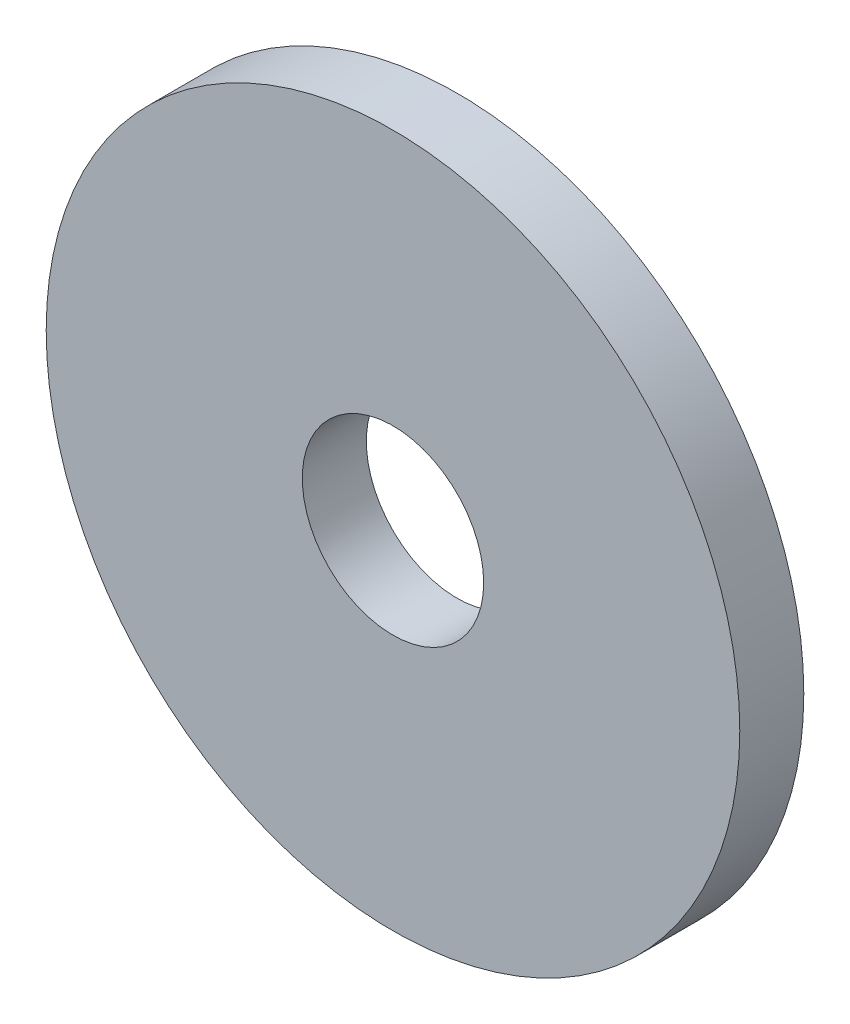
ISO-10303-21;
HEADER;
FILE_DESCRIPTION(('STEP AP214'),'2;1');
FILE_NAME('part.step','',(''),(''),'','','');
FILE_SCHEMA(('AUTOMOTIVE_DESIGN { 1 0 10303 214 1 1 1 1 }'));
ENDSEC;
DATA;
#1=APPLICATION_CONTEXT('core data for automotive mechanical design processes');
#2=APPLICATION_PROTOCOL_DEFINITION('international standard','automotive_design',2000,#1);
#3=PRODUCT_CONTEXT('',#1,'mechanical');
#4=PRODUCT('Part','Part','',(#3));
#5=PRODUCT_RELATED_PRODUCT_CATEGORY('part','',(#4));
#6=PRODUCT_DEFINITION_FORMATION('','',#4);
#7=PRODUCT_DEFINITION_CONTEXT('part definition',#1,'design');
#8=PRODUCT_DEFINITION('design','',#6,#7);
#9=PRODUCT_DEFINITION_SHAPE('','',#8);
#10=(LENGTH_UNIT() NAMED_UNIT(*) SI_UNIT(.MILLI.,.METRE.));
#11=(NAMED_UNIT(*) PLANE_ANGLE_UNIT() SI_UNIT($,.RADIAN.));
#12=(NAMED_UNIT(*) SI_UNIT($,.STERADIAN.) SOLID_ANGLE_UNIT());
#13=UNCERTAINTY_MEASURE_WITH_UNIT(LENGTH_MEASURE(1.E-05),#10,'distance_accuracy_value','');
#14=(GEOMETRIC_REPRESENTATION_CONTEXT(3) GLOBAL_UNCERTAINTY_ASSIGNED_CONTEXT((#13)) GLOBAL_UNIT_ASSIGNED_CONTEXT((#10,
#11,#12)) REPRESENTATION_CONTEXT('',''));
#15=CARTESIAN_POINT('',(0.,0.,0.));
#16=DIRECTION('',(0.,0.,1.));
#17=DIRECTION('',(1.,0.,0.));
#18=AXIS2_PLACEMENT_3D('',#15,#16,#17);
#19=CARTESIAN_POINT('',(0.,0.,6.));
#20=DIRECTION('',(0.,0.,1.));
#21=DIRECTION('',(1.,0.,0.));
#22=AXIS2_PLACEMENT_3D('',#19,#20,#21);
#23=PLANE('',#22);
#24=CARTESIAN_POINT('',(0.,0.,6.));
#25=DIRECTION('',(0.,0.,1.));
#26=DIRECTION('',(1.,0.,0.));
#27=AXIS2_PLACEMENT_3D('',#24,#25,#26);
#28=CIRCLE('',#27,32.5);
#29=CARTESIAN_POINT('',(32.5,0.,6.));
#30=VERTEX_POINT('',#29);
#31=EDGE_CURVE('E10',#30,#30,#28,.T.);
#32=ORIENTED_EDGE('',*,*,#31,.T.);
#33=EDGE_LOOP('',(#32));
#34=FACE_BOUND('',#33,.T.);
#35=CARTESIAN_POINT('',(0.,0.,6.));
#36=DIRECTION('',(0.,0.,1.));
#37=DIRECTION('',(1.,0.,0.));
#38=AXIS2_PLACEMENT_3D('',#35,#36,#37);
#39=CIRCLE('',#38,8.5);
#40=CARTESIAN_POINT('',(8.5,0.,6.));
#41=VERTEX_POINT('',#40);
#42=EDGE_CURVE('E41',#41,#41,#39,.T.);
#43=ORIENTED_EDGE('',*,*,#42,.F.);
#44=EDGE_LOOP('',(#43));
#45=FACE_BOUND('',#44,.T.);
#46=ADVANCED_FACE('F30',(#34,#45),#23,.T.);
#47=CARTESIAN_POINT('',(0.,0.,0.));
#48=DIRECTION('',(0.,0.,1.));
#49=DIRECTION('',(1.,0.,0.));
#50=AXIS2_PLACEMENT_3D('',#47,#48,#49);
#51=PLANE('',#50);
#52=CARTESIAN_POINT('',(0.,0.,0.));
#53=DIRECTION('',(0.,0.,1.));
#54=DIRECTION('',(1.,0.,0.));
#55=AXIS2_PLACEMENT_3D('',#52,#53,#54);
#56=CIRCLE('',#55,32.5);
#57=CARTESIAN_POINT('',(32.5,0.,0.));
#58=VERTEX_POINT('',#57);
#59=EDGE_CURVE('E34',#58,#58,#56,.T.);
#60=ORIENTED_EDGE('',*,*,#59,.F.);
#61=EDGE_LOOP('',(#60));
#62=FACE_BOUND('',#61,.T.);
#63=CARTESIAN_POINT('',(0.,0.,0.));
#64=DIRECTION('',(0.,0.,1.));
#65=DIRECTION('',(1.,0.,0.));
#66=AXIS2_PLACEMENT_3D('',#63,#64,#65);
#67=CIRCLE('',#66,8.5);
#68=CARTESIAN_POINT('',(8.5,0.,0.));
#69=VERTEX_POINT('',#68);
#70=EDGE_CURVE('E43',#69,#69,#67,.T.);
#71=ORIENTED_EDGE('',*,*,#70,.T.);
#72=EDGE_LOOP('',(#71));
#73=FACE_BOUND('',#72,.T.);
#74=ADVANCED_FACE('F53',(#62,#73),#51,.F.);
#75=CARTESIAN_POINT('',(0.,0.,6.));
#76=DIRECTION('',(0.,0.,-1.));
#77=DIRECTION('',(-1.,0.,0.));
#78=AXIS2_PLACEMENT_3D('',#75,#76,#77);
#79=CYLINDRICAL_SURFACE('',#78,32.5);
#80=ORIENTED_EDGE('',*,*,#31,.F.);
#81=EDGE_LOOP('',(#80));
#82=FACE_BOUND('',#81,.T.);
#83=ORIENTED_EDGE('',*,*,#59,.T.);
#84=EDGE_LOOP('',(#83));
#85=FACE_BOUND('',#84,.T.);
#86=ADVANCED_FACE('F32',(#82,#85),#79,.T.);
#87=CARTESIAN_POINT('',(0.,0.,6.));
#88=DIRECTION('',(0.,0.,-1.));
#89=DIRECTION('',(-1.,0.,0.));
#90=AXIS2_PLACEMENT_3D('',#87,#88,#89);
#91=CYLINDRICAL_SURFACE('',#90,8.5);
#92=ORIENTED_EDGE('',*,*,#42,.T.);
#93=EDGE_LOOP('',(#92));
#94=FACE_BOUND('',#93,.T.);
#95=ORIENTED_EDGE('',*,*,#70,.F.);
#96=EDGE_LOOP('',(#95));
#97=FACE_BOUND('',#96,.T.);
#98=ADVANCED_FACE('F49',(#94,#97),#91,.F.);
#99=CLOSED_SHELL('',(#46,#74,#86,#98));
#100=MANIFOLD_SOLID_BREP('B2',#99);
#101=ADVANCED_BREP_SHAPE_REPRESENTATION('',(#18,#100),#14);
#102=SHAPE_DEFINITION_REPRESENTATION(#9,#101);
ENDSEC;
END-ISO-10303-21;
